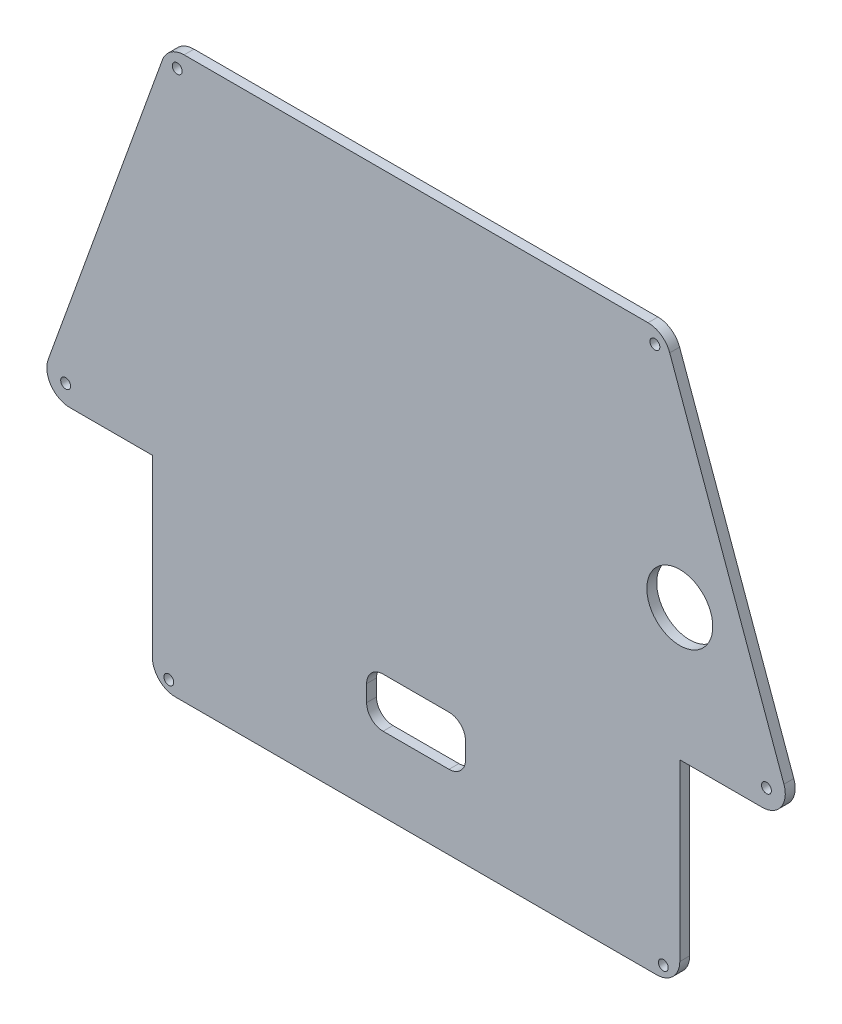
ISO-10303-21;
HEADER;
FILE_DESCRIPTION(('STEP AP214'),'2;1');
FILE_NAME('part.step','',(''),(''),'','','');
FILE_SCHEMA(('AUTOMOTIVE_DESIGN { 1 0 10303 214 1 1 1 1 }'));
ENDSEC;
DATA;
#1=APPLICATION_CONTEXT('core data for automotive mechanical design processes');
#2=APPLICATION_PROTOCOL_DEFINITION('international standard','automotive_design',2000,#1);
#3=PRODUCT_CONTEXT('',#1,'mechanical');
#4=PRODUCT('Part','Part','',(#3));
#5=PRODUCT_RELATED_PRODUCT_CATEGORY('part','',(#4));
#6=PRODUCT_DEFINITION_FORMATION('','',#4);
#7=PRODUCT_DEFINITION_CONTEXT('part definition',#1,'design');
#8=PRODUCT_DEFINITION('design','',#6,#7);
#9=PRODUCT_DEFINITION_SHAPE('','',#8);
#10=(LENGTH_UNIT() NAMED_UNIT(*) SI_UNIT(.MILLI.,.METRE.));
#11=(NAMED_UNIT(*) PLANE_ANGLE_UNIT() SI_UNIT($,.RADIAN.));
#12=(NAMED_UNIT(*) SI_UNIT($,.STERADIAN.) SOLID_ANGLE_UNIT());
#13=UNCERTAINTY_MEASURE_WITH_UNIT(LENGTH_MEASURE(1.E-05),#10,'distance_accuracy_value','');
#14=(GEOMETRIC_REPRESENTATION_CONTEXT(3) GLOBAL_UNCERTAINTY_ASSIGNED_CONTEXT((#13)) GLOBAL_UNIT_ASSIGNED_CONTEXT((#10,
#11,#12)) REPRESENTATION_CONTEXT('',''));
#15=CARTESIAN_POINT('',(0.,0.,0.));
#16=DIRECTION('',(0.,0.,1.));
#17=DIRECTION('',(1.,0.,0.));
#18=AXIS2_PLACEMENT_3D('',#15,#16,#17);
#19=CARTESIAN_POINT('',(105.000000000002,67.0000000000007,3.));
#20=DIRECTION('',(0.,0.,1.));
#21=DIRECTION('',(1.,0.,0.));
#22=AXIS2_PLACEMENT_3D('',#19,#20,#21);
#23=PLANE('',#22);
#24=CARTESIAN_POINT('',(-72.4413822321716,165.375717781692,3.));
#25=DIRECTION('',(0.,0.,1.));
#26=DIRECTION('',(1.,0.,0.));
#27=AXIS2_PLACEMENT_3D('',#24,#25,#26);
#28=CIRCLE('',#27,1.5);
#29=CARTESIAN_POINT('',(-70.9413822321716,165.375717781692,3.));
#30=VERTEX_POINT('',#29);
#31=EDGE_CURVE('E722',#30,#30,#28,.T.);
#32=ORIENTED_EDGE('',*,*,#31,.F.);
#33=EDGE_LOOP('',(#32));
#34=FACE_BOUND('',#33,.T.);
#35=CARTESIAN_POINT('',(106.291485680488,65.7561376704463,3.));
#36=DIRECTION('',(0.,0.,1.));
#37=DIRECTION('',(-1.,0.,0.));
#38=AXIS2_PLACEMENT_3D('',#35,#36,#37);
#39=CIRCLE('',#38,1.5);
#40=CARTESIAN_POINT('',(104.791485680488,65.7561376704463,3.));
#41=VERTEX_POINT('',#40);
#42=EDGE_CURVE('E222',#41,#41,#39,.T.);
#43=ORIENTED_EDGE('',*,*,#42,.F.);
#44=EDGE_LOOP('',(#43));
#45=FACE_BOUND('',#44,.T.);
#46=CARTESIAN_POINT('',(-74.9999999999981,3.55203370173264,3.));
#47=DIRECTION('',(0.,0.,1.));
#48=DIRECTION('',(1.,0.,0.));
#49=AXIS2_PLACEMENT_3D('',#46,#47,#48);
#50=CIRCLE('',#49,1.50000000000001);
#51=CARTESIAN_POINT('',(-73.4999999999981,3.55203370173264,3.));
#52=VERTEX_POINT('',#51);
#53=EDGE_CURVE('E258',#52,#52,#50,.T.);
#54=ORIENTED_EDGE('',*,*,#53,.F.);
#55=EDGE_LOOP('',(#54));
#56=FACE_BOUND('',#55,.T.);
#57=CARTESIAN_POINT('',(105.000000000002,67.0000000000007,3.));
#58=DIRECTION('',(0.,0.,1.));
#59=DIRECTION('',(1.,0.,0.));
#60=AXIS2_PLACEMENT_3D('',#57,#58,#59);
#61=CIRCLE('',#60,7.00000000000002);
#62=CARTESIAN_POINT('',(105.000000000002,60.0000000000007,3.));
#63=VERTEX_POINT('',#62);
#64=CARTESIAN_POINT('',(111.584524661794,69.3757177816926,3.));
#65=VERTEX_POINT('',#64);
#66=EDGE_CURVE('E270',#63,#65,#61,.T.);
#67=ORIENTED_EDGE('',*,*,#66,.T.);
#68=DIRECTION('',(-0.33938825452742,0.940646380256062,0.));
#69=VECTOR('',#68,1.);
#70=CARTESIAN_POINT('',(111.584524661794,69.3757177816926,3.));
#71=LINE('',#70,#69);
#72=CARTESIAN_POINT('',(76.9474143528568,165.375717781692,3.));
#73=VERTEX_POINT('',#72);
#74=EDGE_CURVE('E273',#65,#73,#71,.T.);
#75=ORIENTED_EDGE('',*,*,#74,.T.);
#76=CARTESIAN_POINT('',(70.3628896910644,163.,3.));
#77=DIRECTION('',(0.,0.,1.));
#78=DIRECTION('',(1.,0.,0.));
#79=AXIS2_PLACEMENT_3D('',#76,#77,#78);
#80=CIRCLE('',#79,7.00000000000001);
#81=CARTESIAN_POINT('',(70.3628896910644,170.,3.));
#82=VERTEX_POINT('',#81);
#83=EDGE_CURVE('E276',#73,#82,#80,.T.);
#84=ORIENTED_EDGE('',*,*,#83,.T.);
#85=DIRECTION('',(-1.,0.,0.));
#86=VECTOR('',#85,1.);
#87=CARTESIAN_POINT('',(-70.3628896910606,170.,3.));
#88=LINE('',#87,#86);
#89=CARTESIAN_POINT('',(-70.3628896910606,170.,3.));
#90=VERTEX_POINT('',#89);
#91=EDGE_CURVE('E278',#82,#90,#88,.T.);
#92=ORIENTED_EDGE('',*,*,#91,.T.);
#93=CARTESIAN_POINT('',(-70.3628896910606,163.,3.));
#94=DIRECTION('',(0.,0.,1.));
#95=DIRECTION('',(-1.,0.,0.));
#96=AXIS2_PLACEMENT_3D('',#93,#94,#95);
#97=CIRCLE('',#96,7.00000000000002);
#98=CARTESIAN_POINT('',(-76.947414352853,165.375717781692,3.));
#99=VERTEX_POINT('',#98);
#100=EDGE_CURVE('E280',#90,#99,#97,.T.);
#101=ORIENTED_EDGE('',*,*,#100,.T.);
#102=DIRECTION('',(-0.339388254527417,-0.940646380256063,0.));
#103=VECTOR('',#102,1.);
#104=CARTESIAN_POINT('',(-111.584524661791,69.3757177816919,3.));
#105=LINE('',#104,#103);
#106=CARTESIAN_POINT('',(-111.584524661791,69.3757177816919,3.));
#107=VERTEX_POINT('',#106);
#108=EDGE_CURVE('E282',#99,#107,#105,.T.);
#109=ORIENTED_EDGE('',*,*,#108,.T.);
#110=CARTESIAN_POINT('',(-104.999999999998,67.,3.));
#111=DIRECTION('',(0.,0.,1.));
#112=DIRECTION('',(-1.,0.,0.));
#113=AXIS2_PLACEMENT_3D('',#110,#111,#112);
#114=CIRCLE('',#113,7.);
#115=CARTESIAN_POINT('',(-104.999999999998,60.,3.));
#116=VERTEX_POINT('',#115);
#117=EDGE_CURVE('E284',#107,#116,#114,.T.);
#118=ORIENTED_EDGE('',*,*,#117,.T.);
#119=DIRECTION('',(1.,0.,0.));
#120=VECTOR('',#119,1.);
#121=CARTESIAN_POINT('',(-79.9999999999981,60.,3.));
#122=LINE('',#121,#120);
#123=CARTESIAN_POINT('',(-79.9999999999981,60.,3.));
#124=VERTEX_POINT('',#123);
#125=EDGE_CURVE('E286',#116,#124,#122,.T.);
#126=ORIENTED_EDGE('',*,*,#125,.T.);
#127=DIRECTION('',(0.,-1.,0.));
#128=VECTOR('',#127,1.);
#129=CARTESIAN_POINT('',(-79.9999999999981,7.,3.));
#130=LINE('',#129,#128);
#131=CARTESIAN_POINT('',(-79.9999999999981,7.,3.));
#132=VERTEX_POINT('',#131);
#133=EDGE_CURVE('E288',#124,#132,#130,.T.);
#134=ORIENTED_EDGE('',*,*,#133,.T.);
#135=CARTESIAN_POINT('',(-72.9999999999981,7.,3.));
#136=DIRECTION('',(0.,0.,1.));
#137=DIRECTION('',(1.,0.,0.));
#138=AXIS2_PLACEMENT_3D('',#135,#136,#137);
#139=CIRCLE('',#138,7.00000000000001);
#140=CARTESIAN_POINT('',(-72.9999999999981,0.,3.));
#141=VERTEX_POINT('',#140);
#142=EDGE_CURVE('E290',#132,#141,#139,.T.);
#143=ORIENTED_EDGE('',*,*,#142,.T.);
#144=DIRECTION('',(1.,0.,0.));
#145=VECTOR('',#144,1.);
#146=CARTESIAN_POINT('',(-72.9999999999981,0.,3.));
#147=LINE('',#146,#145);
#148=CARTESIAN_POINT('',(73.0000000000019,0.,3.));
#149=VERTEX_POINT('',#148);
#150=EDGE_CURVE('E292',#141,#149,#147,.T.);
#151=ORIENTED_EDGE('',*,*,#150,.T.);
#152=CARTESIAN_POINT('',(73.0000000000019,7.,3.));
#153=DIRECTION('',(0.,0.,1.));
#154=DIRECTION('',(1.,0.,0.));
#155=AXIS2_PLACEMENT_3D('',#152,#153,#154);
#156=CIRCLE('',#155,7.00000000000001);
#157=CARTESIAN_POINT('',(80.0000000000019,7.,3.));
#158=VERTEX_POINT('',#157);
#159=EDGE_CURVE('E294',#149,#158,#156,.T.);
#160=ORIENTED_EDGE('',*,*,#159,.T.);
#161=DIRECTION('',(0.,1.,0.));
#162=VECTOR('',#161,1.);
#163=CARTESIAN_POINT('',(80.0000000000019,7.,3.));
#164=LINE('',#163,#162);
#165=CARTESIAN_POINT('',(80.0000000000019,60.0000000000007,3.));
#166=VERTEX_POINT('',#165);
#167=EDGE_CURVE('E296',#158,#166,#164,.T.);
#168=ORIENTED_EDGE('',*,*,#167,.T.);
#169=DIRECTION('',(1.,0.,0.));
#170=VECTOR('',#169,1.);
#171=CARTESIAN_POINT('',(80.0000000000019,60.0000000000007,3.));
#172=LINE('',#171,#170);
#173=EDGE_CURVE('E298',#166,#63,#172,.T.);
#174=ORIENTED_EDGE('',*,*,#173,.T.);
#175=EDGE_LOOP('',(#67,#75,#84,#92,#101,#109,#118,#126,#134,#143,#151,#160,#168,#174));
#176=FACE_BOUND('',#175,.T.);
#177=CARTESIAN_POINT('',(80.0000000000019,100.000000000001,3.));
#178=DIRECTION('',(0.,0.,1.));
#179=DIRECTION('',(1.,0.,0.));
#180=AXIS2_PLACEMENT_3D('',#177,#178,#179);
#181=CIRCLE('',#180,9.99999999999999);
#182=CARTESIAN_POINT('',(90.0000000000019,100.000000000001,3.));
#183=VERTEX_POINT('',#182);
#184=EDGE_CURVE('E264',#183,#183,#181,.T.);
#185=ORIENTED_EDGE('',*,*,#184,.F.);
#186=EDGE_LOOP('',(#185));
#187=FACE_BOUND('',#186,.T.);
#188=CARTESIAN_POINT('',(-106.291485680485,65.7561376704463,3.));
#189=DIRECTION('',(0.,0.,1.));
#190=DIRECTION('',(1.,0.,0.));
#191=AXIS2_PLACEMENT_3D('',#188,#189,#190);
#192=CIRCLE('',#191,1.5);
#193=CARTESIAN_POINT('',(-104.791485680485,65.7561376704463,3.));
#194=VERTEX_POINT('',#193);
#195=EDGE_CURVE('E252',#194,#194,#192,.T.);
#196=ORIENTED_EDGE('',*,*,#195,.F.);
#197=EDGE_LOOP('',(#196));
#198=FACE_BOUND('',#197,.T.);
#199=DIRECTION('',(0.,1.,0.));
#200=VECTOR('',#199,1.);
#201=CARTESIAN_POINT('',(15.0000000000019,27.5,3.));
#202=LINE('',#201,#200);
#203=CARTESIAN_POINT('',(15.0000000000019,27.5,3.));
#204=VERTEX_POINT('',#203);
#205=CARTESIAN_POINT('',(15.0000000000019,32.5,3.));
#206=VERTEX_POINT('',#205);
#207=EDGE_CURVE('E192',#204,#206,#202,.T.);
#208=ORIENTED_EDGE('',*,*,#207,.F.);
#209=CARTESIAN_POINT('',(10.0000000000019,27.5,3.));
#210=DIRECTION('',(0.,0.,1.));
#211=DIRECTION('',(1.,0.,0.));
#212=AXIS2_PLACEMENT_3D('',#209,#210,#211);
#213=CIRCLE('',#212,5.);
#214=CARTESIAN_POINT('',(10.0000000000019,22.5,3.));
#215=VERTEX_POINT('',#214);
#216=EDGE_CURVE('E184',#215,#204,#213,.T.);
#217=ORIENTED_EDGE('',*,*,#216,.F.);
#218=DIRECTION('',(1.,0.,0.));
#219=VECTOR('',#218,1.);
#220=CARTESIAN_POINT('',(-9.9999999999981,22.5,3.));
#221=LINE('',#220,#219);
#222=CARTESIAN_POINT('',(-9.99999999999809,22.5,3.));
#223=VERTEX_POINT('',#222);
#224=EDGE_CURVE('E219',#223,#215,#221,.T.);
#225=ORIENTED_EDGE('',*,*,#224,.F.);
#226=CARTESIAN_POINT('',(-9.9999999999981,27.5,3.));
#227=DIRECTION('',(0.,0.,1.));
#228=DIRECTION('',(-1.,0.,0.));
#229=AXIS2_PLACEMENT_3D('',#226,#227,#228);
#230=CIRCLE('',#229,5.);
#231=CARTESIAN_POINT('',(-14.9999999999981,27.5,3.));
#232=VERTEX_POINT('',#231);
#233=EDGE_CURVE('E217',#232,#223,#230,.T.);
#234=ORIENTED_EDGE('',*,*,#233,.F.);
#235=DIRECTION('',(0.,-1.,0.));
#236=VECTOR('',#235,1.);
#237=CARTESIAN_POINT('',(-14.9999999999981,27.5,3.));
#238=LINE('',#237,#236);
#239=CARTESIAN_POINT('',(-14.9999999999981,32.5,3.));
#240=VERTEX_POINT('',#239);
#241=EDGE_CURVE('E215',#240,#232,#238,.T.);
#242=ORIENTED_EDGE('',*,*,#241,.F.);
#243=CARTESIAN_POINT('',(-9.9999999999981,32.5,3.));
#244=DIRECTION('',(0.,0.,1.));
#245=DIRECTION('',(-1.,0.,0.));
#246=AXIS2_PLACEMENT_3D('',#243,#244,#245);
#247=CIRCLE('',#246,5.);
#248=CARTESIAN_POINT('',(-9.9999999999981,37.5,3.));
#249=VERTEX_POINT('',#248);
#250=EDGE_CURVE('E213',#249,#240,#247,.T.);
#251=ORIENTED_EDGE('',*,*,#250,.F.);
#252=DIRECTION('',(-1.,0.,0.));
#253=VECTOR('',#252,1.);
#254=CARTESIAN_POINT('',(-9.9999999999981,37.5,3.));
#255=LINE('',#254,#253);
#256=CARTESIAN_POINT('',(10.0000000000019,37.5,3.));
#257=VERTEX_POINT('',#256);
#258=EDGE_CURVE('E208',#257,#249,#255,.T.);
#259=ORIENTED_EDGE('',*,*,#258,.F.);
#260=CARTESIAN_POINT('',(10.0000000000019,32.5,3.));
#261=DIRECTION('',(0.,0.,1.));
#262=DIRECTION('',(-1.,0.,0.));
#263=AXIS2_PLACEMENT_3D('',#260,#261,#262);
#264=CIRCLE('',#263,5.);
#265=EDGE_CURVE('E206',#206,#257,#264,.T.);
#266=ORIENTED_EDGE('',*,*,#265,.F.);
#267=EDGE_LOOP('',(#208,#217,#225,#234,#242,#251,#259,#266));
#268=FACE_BOUND('',#267,.T.);
#269=CARTESIAN_POINT('',(72.4413822321753,165.375717781692,3.));
#270=DIRECTION('',(0.,0.,1.));
#271=DIRECTION('',(-1.,0.,0.));
#272=AXIS2_PLACEMENT_3D('',#269,#270,#271);
#273=CIRCLE('',#272,1.5);
#274=CARTESIAN_POINT('',(70.9413822321753,165.375717781692,3.));
#275=VERTEX_POINT('',#274);
#276=EDGE_CURVE('E728',#275,#275,#273,.T.);
#277=ORIENTED_EDGE('',*,*,#276,.F.);
#278=EDGE_LOOP('',(#277));
#279=FACE_BOUND('',#278,.T.);
#280=CARTESIAN_POINT('',(75.0000000000019,3.55203370173264,3.));
#281=DIRECTION('',(0.,0.,1.));
#282=DIRECTION('',(-1.,0.,0.));
#283=AXIS2_PLACEMENT_3D('',#280,#281,#282);
#284=CIRCLE('',#283,1.50000000000001);
#285=CARTESIAN_POINT('',(73.5000000000019,3.55203370173264,3.));
#286=VERTEX_POINT('',#285);
#287=EDGE_CURVE('E713',#286,#286,#284,.T.);
#288=ORIENTED_EDGE('',*,*,#287,.F.);
#289=EDGE_LOOP('',(#288));
#290=FACE_BOUND('',#289,.T.);
#291=ADVANCED_FACE('F35',(#34,#45,#56,#176,#187,#198,#268,#279,#290),#23,.T.);
#292=CARTESIAN_POINT('',(105.000000000002,67.0000000000007,0.));
#293=DIRECTION('',(0.,0.,1.));
#294=DIRECTION('',(1.,0.,0.));
#295=AXIS2_PLACEMENT_3D('',#292,#293,#294);
#296=PLANE('',#295);
#297=CARTESIAN_POINT('',(-106.291485680485,65.7561376704463,0.));
#298=DIRECTION('',(0.,0.,1.));
#299=DIRECTION('',(1.,0.,0.));
#300=AXIS2_PLACEMENT_3D('',#297,#298,#299);
#301=CIRCLE('',#300,1.5);
#302=CARTESIAN_POINT('',(-104.791485680485,65.7561376704463,0.));
#303=VERTEX_POINT('',#302);
#304=EDGE_CURVE('E200',#303,#303,#301,.T.);
#305=ORIENTED_EDGE('',*,*,#304,.T.);
#306=EDGE_LOOP('',(#305));
#307=FACE_BOUND('',#306,.T.);
#308=CARTESIAN_POINT('',(-74.9999999999981,3.55203370173264,0.));
#309=DIRECTION('',(0.,0.,1.));
#310=DIRECTION('',(1.,0.,0.));
#311=AXIS2_PLACEMENT_3D('',#308,#309,#310);
#312=CIRCLE('',#311,1.50000000000001);
#313=CARTESIAN_POINT('',(-73.4999999999981,3.55203370173264,0.));
#314=VERTEX_POINT('',#313);
#315=EDGE_CURVE('E255',#314,#314,#312,.T.);
#316=ORIENTED_EDGE('',*,*,#315,.T.);
#317=EDGE_LOOP('',(#316));
#318=FACE_BOUND('',#317,.T.);
#319=CARTESIAN_POINT('',(80.0000000000019,100.000000000001,0.));
#320=DIRECTION('',(0.,0.,1.));
#321=DIRECTION('',(1.,0.,0.));
#322=AXIS2_PLACEMENT_3D('',#319,#320,#321);
#323=CIRCLE('',#322,9.99999999999999);
#324=CARTESIAN_POINT('',(90.0000000000019,100.000000000001,0.));
#325=VERTEX_POINT('',#324);
#326=EDGE_CURVE('E261',#325,#325,#323,.T.);
#327=ORIENTED_EDGE('',*,*,#326,.T.);
#328=EDGE_LOOP('',(#327));
#329=FACE_BOUND('',#328,.T.);
#330=CARTESIAN_POINT('',(105.000000000002,67.0000000000007,0.));
#331=DIRECTION('',(0.,0.,1.));
#332=DIRECTION('',(1.,0.,0.));
#333=AXIS2_PLACEMENT_3D('',#330,#331,#332);
#334=CIRCLE('',#333,7.00000000000002);
#335=CARTESIAN_POINT('',(105.000000000002,60.0000000000007,0.));
#336=VERTEX_POINT('',#335);
#337=CARTESIAN_POINT('',(111.584524661794,69.3757177816926,0.));
#338=VERTEX_POINT('',#337);
#339=EDGE_CURVE('E267',#336,#338,#334,.T.);
#340=ORIENTED_EDGE('',*,*,#339,.F.);
#341=DIRECTION('',(1.,0.,0.));
#342=VECTOR('',#341,1.);
#343=CARTESIAN_POINT('',(80.0000000000019,60.0000000000007,0.));
#344=LINE('',#343,#342);
#345=CARTESIAN_POINT('',(80.0000000000019,60.0000000000007,0.));
#346=VERTEX_POINT('',#345);
#347=EDGE_CURVE('E274',#346,#336,#344,.T.);
#348=ORIENTED_EDGE('',*,*,#347,.F.);
#349=DIRECTION('',(0.,1.,0.));
#350=VECTOR('',#349,1.);
#351=CARTESIAN_POINT('',(80.0000000000019,7.,0.));
#352=LINE('',#351,#350);
#353=CARTESIAN_POINT('',(80.0000000000019,7.,0.));
#354=VERTEX_POINT('',#353);
#355=EDGE_CURVE('E325',#354,#346,#352,.T.);
#356=ORIENTED_EDGE('',*,*,#355,.F.);
#357=CARTESIAN_POINT('',(73.0000000000019,7.,0.));
#358=DIRECTION('',(0.,0.,1.));
#359=DIRECTION('',(1.,0.,0.));
#360=AXIS2_PLACEMENT_3D('',#357,#358,#359);
#361=CIRCLE('',#360,7.00000000000001);
#362=CARTESIAN_POINT('',(73.0000000000019,0.,0.));
#363=VERTEX_POINT('',#362);
#364=EDGE_CURVE('E323',#363,#354,#361,.T.);
#365=ORIENTED_EDGE('',*,*,#364,.F.);
#366=DIRECTION('',(1.,0.,0.));
#367=VECTOR('',#366,1.);
#368=CARTESIAN_POINT('',(-72.9999999999981,0.,0.));
#369=LINE('',#368,#367);
#370=CARTESIAN_POINT('',(-72.9999999999981,0.,0.));
#371=VERTEX_POINT('',#370);
#372=EDGE_CURVE('E321',#371,#363,#369,.T.);
#373=ORIENTED_EDGE('',*,*,#372,.F.);
#374=CARTESIAN_POINT('',(-72.9999999999981,7.,0.));
#375=DIRECTION('',(0.,0.,1.));
#376=DIRECTION('',(1.,0.,0.));
#377=AXIS2_PLACEMENT_3D('',#374,#375,#376);
#378=CIRCLE('',#377,7.00000000000001);
#379=CARTESIAN_POINT('',(-79.9999999999981,7.,0.));
#380=VERTEX_POINT('',#379);
#381=EDGE_CURVE('E319',#380,#371,#378,.T.);
#382=ORIENTED_EDGE('',*,*,#381,.F.);
#383=DIRECTION('',(0.,-1.,0.));
#384=VECTOR('',#383,1.);
#385=CARTESIAN_POINT('',(-79.9999999999981,7.,0.));
#386=LINE('',#385,#384);
#387=CARTESIAN_POINT('',(-79.9999999999981,60.,0.));
#388=VERTEX_POINT('',#387);
#389=EDGE_CURVE('E317',#388,#380,#386,.T.);
#390=ORIENTED_EDGE('',*,*,#389,.F.);
#391=DIRECTION('',(1.,0.,0.));
#392=VECTOR('',#391,1.);
#393=CARTESIAN_POINT('',(-79.9999999999981,60.,0.));
#394=LINE('',#393,#392);
#395=CARTESIAN_POINT('',(-104.999999999998,60.,0.));
#396=VERTEX_POINT('',#395);
#397=EDGE_CURVE('E315',#396,#388,#394,.T.);
#398=ORIENTED_EDGE('',*,*,#397,.F.);
#399=CARTESIAN_POINT('',(-104.999999999998,67.,0.));
#400=DIRECTION('',(0.,0.,1.));
#401=DIRECTION('',(-1.,0.,0.));
#402=AXIS2_PLACEMENT_3D('',#399,#400,#401);
#403=CIRCLE('',#402,7.);
#404=CARTESIAN_POINT('',(-111.584524661791,69.3757177816919,0.));
#405=VERTEX_POINT('',#404);
#406=EDGE_CURVE('E313',#405,#396,#403,.T.);
#407=ORIENTED_EDGE('',*,*,#406,.F.);
#408=DIRECTION('',(-0.339388254527417,-0.940646380256063,0.));
#409=VECTOR('',#408,1.);
#410=CARTESIAN_POINT('',(-111.584524661791,69.3757177816919,0.));
#411=LINE('',#410,#409);
#412=CARTESIAN_POINT('',(-76.947414352853,165.375717781692,0.));
#413=VERTEX_POINT('',#412);
#414=EDGE_CURVE('E311',#413,#405,#411,.T.);
#415=ORIENTED_EDGE('',*,*,#414,.F.);
#416=CARTESIAN_POINT('',(-70.3628896910606,163.,0.));
#417=DIRECTION('',(0.,0.,1.));
#418=DIRECTION('',(-1.,0.,0.));
#419=AXIS2_PLACEMENT_3D('',#416,#417,#418);
#420=CIRCLE('',#419,7.00000000000002);
#421=CARTESIAN_POINT('',(-70.3628896910606,170.,0.));
#422=VERTEX_POINT('',#421);
#423=EDGE_CURVE('E309',#422,#413,#420,.T.);
#424=ORIENTED_EDGE('',*,*,#423,.F.);
#425=DIRECTION('',(-1.,0.,0.));
#426=VECTOR('',#425,1.);
#427=CARTESIAN_POINT('',(-70.3628896910606,170.,0.));
#428=LINE('',#427,#426);
#429=CARTESIAN_POINT('',(70.3628896910644,170.,0.));
#430=VERTEX_POINT('',#429);
#431=EDGE_CURVE('E307',#430,#422,#428,.T.);
#432=ORIENTED_EDGE('',*,*,#431,.F.);
#433=CARTESIAN_POINT('',(70.3628896910644,163.,0.));
#434=DIRECTION('',(0.,0.,1.));
#435=DIRECTION('',(1.,0.,0.));
#436=AXIS2_PLACEMENT_3D('',#433,#434,#435);
#437=CIRCLE('',#436,7.00000000000001);
#438=CARTESIAN_POINT('',(76.9474143528568,165.375717781692,0.));
#439=VERTEX_POINT('',#438);
#440=EDGE_CURVE('E305',#439,#430,#437,.T.);
#441=ORIENTED_EDGE('',*,*,#440,.F.);
#442=DIRECTION('',(-0.33938825452742,0.940646380256062,0.));
#443=VECTOR('',#442,1.);
#444=CARTESIAN_POINT('',(111.584524661794,69.3757177816926,0.));
#445=LINE('',#444,#443);
#446=EDGE_CURVE('E303',#338,#439,#445,.T.);
#447=ORIENTED_EDGE('',*,*,#446,.F.);
#448=EDGE_LOOP('',(#340,#348,#356,#365,#373,#382,#390,#398,#407,#415,#424,#432,#441,#447));
#449=FACE_BOUND('',#448,.T.);
#450=CARTESIAN_POINT('',(10.0000000000019,27.5,0.));
#451=DIRECTION('',(0.,0.,1.));
#452=DIRECTION('',(1.,0.,0.));
#453=AXIS2_PLACEMENT_3D('',#450,#451,#452);
#454=CIRCLE('',#453,5.);
#455=CARTESIAN_POINT('',(10.0000000000019,22.5,0.));
#456=VERTEX_POINT('',#455);
#457=CARTESIAN_POINT('',(15.0000000000019,27.5,0.));
#458=VERTEX_POINT('',#457);
#459=EDGE_CURVE('E58',#456,#458,#454,.T.);
#460=ORIENTED_EDGE('',*,*,#459,.T.);
#461=DIRECTION('',(0.,1.,0.));
#462=VECTOR('',#461,1.);
#463=CARTESIAN_POINT('',(15.0000000000019,27.5,0.));
#464=LINE('',#463,#462);
#465=CARTESIAN_POINT('',(15.0000000000019,32.5,0.));
#466=VERTEX_POINT('',#465);
#467=EDGE_CURVE('E199',#458,#466,#464,.T.);
#468=ORIENTED_EDGE('',*,*,#467,.T.);
#469=CARTESIAN_POINT('',(10.0000000000019,32.5,0.));
#470=DIRECTION('',(0.,0.,1.));
#471=DIRECTION('',(-1.,0.,0.));
#472=AXIS2_PLACEMENT_3D('',#469,#470,#471);
#473=CIRCLE('',#472,5.);
#474=CARTESIAN_POINT('',(10.0000000000019,37.5,0.));
#475=VERTEX_POINT('',#474);
#476=EDGE_CURVE('E224',#466,#475,#473,.T.);
#477=ORIENTED_EDGE('',*,*,#476,.T.);
#478=DIRECTION('',(-1.,0.,0.));
#479=VECTOR('',#478,1.);
#480=CARTESIAN_POINT('',(-9.9999999999981,37.5,0.));
#481=LINE('',#480,#479);
#482=CARTESIAN_POINT('',(-9.9999999999981,37.5,0.));
#483=VERTEX_POINT('',#482);
#484=EDGE_CURVE('E227',#475,#483,#481,.T.);
#485=ORIENTED_EDGE('',*,*,#484,.T.);
#486=CARTESIAN_POINT('',(-9.9999999999981,32.5,0.));
#487=DIRECTION('',(0.,0.,1.));
#488=DIRECTION('',(-1.,0.,0.));
#489=AXIS2_PLACEMENT_3D('',#486,#487,#488);
#490=CIRCLE('',#489,5.);
#491=CARTESIAN_POINT('',(-14.9999999999981,32.5,0.));
#492=VERTEX_POINT('',#491);
#493=EDGE_CURVE('E230',#483,#492,#490,.T.);
#494=ORIENTED_EDGE('',*,*,#493,.T.);
#495=DIRECTION('',(0.,-1.,0.));
#496=VECTOR('',#495,1.);
#497=CARTESIAN_POINT('',(-14.9999999999981,27.5,0.));
#498=LINE('',#497,#496);
#499=CARTESIAN_POINT('',(-14.9999999999981,27.5,0.));
#500=VERTEX_POINT('',#499);
#501=EDGE_CURVE('E233',#492,#500,#498,.T.);
#502=ORIENTED_EDGE('',*,*,#501,.T.);
#503=CARTESIAN_POINT('',(-9.9999999999981,27.5,0.));
#504=DIRECTION('',(0.,0.,1.));
#505=DIRECTION('',(-1.,0.,0.));
#506=AXIS2_PLACEMENT_3D('',#503,#504,#505);
#507=CIRCLE('',#506,5.);
#508=CARTESIAN_POINT('',(-9.9999999999981,22.5,0.));
#509=VERTEX_POINT('',#508);
#510=EDGE_CURVE('E236',#500,#509,#507,.T.);
#511=ORIENTED_EDGE('',*,*,#510,.T.);
#512=DIRECTION('',(1.,0.,0.));
#513=VECTOR('',#512,1.);
#514=CARTESIAN_POINT('',(-9.9999999999981,22.5,0.));
#515=LINE('',#514,#513);
#516=EDGE_CURVE('E193',#509,#456,#515,.T.);
#517=ORIENTED_EDGE('',*,*,#516,.T.);
#518=EDGE_LOOP('',(#460,#468,#477,#485,#494,#502,#511,#517));
#519=FACE_BOUND('',#518,.T.);
#520=CARTESIAN_POINT('',(106.291485680488,65.7561376704463,0.));
#521=DIRECTION('',(0.,0.,1.));
#522=DIRECTION('',(-1.,0.,0.));
#523=AXIS2_PLACEMENT_3D('',#520,#521,#522);
#524=CIRCLE('',#523,1.5);
#525=CARTESIAN_POINT('',(104.791485680488,65.7561376704463,0.));
#526=VERTEX_POINT('',#525);
#527=EDGE_CURVE('E731',#526,#526,#524,.T.);
#528=ORIENTED_EDGE('',*,*,#527,.T.);
#529=EDGE_LOOP('',(#528));
#530=FACE_BOUND('',#529,.T.);
#531=CARTESIAN_POINT('',(72.4413822321753,165.375717781692,0.));
#532=DIRECTION('',(0.,0.,1.));
#533=DIRECTION('',(-1.,0.,0.));
#534=AXIS2_PLACEMENT_3D('',#531,#532,#533);
#535=CIRCLE('',#534,1.5);
#536=CARTESIAN_POINT('',(70.9413822321753,165.375717781692,0.));
#537=VERTEX_POINT('',#536);
#538=EDGE_CURVE('E725',#537,#537,#535,.T.);
#539=ORIENTED_EDGE('',*,*,#538,.T.);
#540=EDGE_LOOP('',(#539));
#541=FACE_BOUND('',#540,.T.);
#542=CARTESIAN_POINT('',(-72.4413822321716,165.375717781692,0.));
#543=DIRECTION('',(0.,0.,1.));
#544=DIRECTION('',(1.,0.,0.));
#545=AXIS2_PLACEMENT_3D('',#542,#543,#544);
#546=CIRCLE('',#545,1.5);
#547=CARTESIAN_POINT('',(-70.9413822321716,165.375717781692,0.));
#548=VERTEX_POINT('',#547);
#549=EDGE_CURVE('E719',#548,#548,#546,.T.);
#550=ORIENTED_EDGE('',*,*,#549,.T.);
#551=EDGE_LOOP('',(#550));
#552=FACE_BOUND('',#551,.T.);
#553=CARTESIAN_POINT('',(75.0000000000019,3.55203370173264,0.));
#554=DIRECTION('',(0.,0.,1.));
#555=DIRECTION('',(-1.,0.,0.));
#556=AXIS2_PLACEMENT_3D('',#553,#554,#555);
#557=CIRCLE('',#556,1.50000000000001);
#558=CARTESIAN_POINT('',(73.5000000000019,3.55203370173264,0.));
#559=VERTEX_POINT('',#558);
#560=EDGE_CURVE('E716',#559,#559,#557,.T.);
#561=ORIENTED_EDGE('',*,*,#560,.T.);
#562=EDGE_LOOP('',(#561));
#563=FACE_BOUND('',#562,.T.);
#564=ADVANCED_FACE('F373',(#307,#318,#329,#449,#519,#530,#541,#552,#563),#296,.F.);
#565=CARTESIAN_POINT('',(105.000000000002,67.0000000000007,3.));
#566=DIRECTION('',(0.,0.,-1.));
#567=DIRECTION('',(-1.,0.,0.));
#568=AXIS2_PLACEMENT_3D('',#565,#566,#567);
#569=CYLINDRICAL_SURFACE('',#568,7.00000000000002);
#570=ORIENTED_EDGE('',*,*,#339,.T.);
#571=DIRECTION('',(0.,0.,-1.));
#572=VECTOR('',#571,1.);
#573=CARTESIAN_POINT('',(111.584524661794,69.3757177816926,3.));
#574=LINE('',#573,#572);
#575=EDGE_CURVE('E11',#65,#338,#574,.T.);
#576=ORIENTED_EDGE('',*,*,#575,.F.);
#577=ORIENTED_EDGE('',*,*,#66,.F.);
#578=DIRECTION('',(0.,0.,-1.));
#579=VECTOR('',#578,1.);
#580=CARTESIAN_POINT('',(105.000000000002,60.0000000000007,3.));
#581=LINE('',#580,#579);
#582=EDGE_CURVE('E300',#63,#336,#581,.T.);
#583=ORIENTED_EDGE('',*,*,#582,.T.);
#584=EDGE_LOOP('',(#570,#576,#577,#583));
#585=FACE_BOUND('',#584,.T.);
#586=ADVANCED_FACE('F37',(#585),#569,.T.);
#587=CARTESIAN_POINT('',(111.584524661794,69.3757177816926,3.));
#588=DIRECTION('',(-0.940646380256062,-0.33938825452742,0.));
#589=DIRECTION('',(0.33938825452742,-0.940646380256062,0.));
#590=AXIS2_PLACEMENT_3D('',#587,#588,#589);
#591=PLANE('',#590);
#592=ORIENTED_EDGE('',*,*,#446,.T.);
#593=DIRECTION('',(0.,0.,-1.));
#594=VECTOR('',#593,1.);
#595=CARTESIAN_POINT('',(76.9474143528568,165.375717781692,3.));
#596=LINE('',#595,#594);
#597=EDGE_CURVE('E43',#73,#439,#596,.T.);
#598=ORIENTED_EDGE('',*,*,#597,.F.);
#599=ORIENTED_EDGE('',*,*,#74,.F.);
#600=ORIENTED_EDGE('',*,*,#575,.T.);
#601=EDGE_LOOP('',(#592,#598,#599,#600));
#602=FACE_BOUND('',#601,.T.);
#603=ADVANCED_FACE('F391',(#602),#591,.F.);
#604=CARTESIAN_POINT('',(70.3628896910644,163.,3.));
#605=DIRECTION('',(0.,0.,-1.));
#606=DIRECTION('',(-1.,0.,0.));
#607=AXIS2_PLACEMENT_3D('',#604,#605,#606);
#608=CYLINDRICAL_SURFACE('',#607,7.00000000000001);
#609=ORIENTED_EDGE('',*,*,#440,.T.);
#610=DIRECTION('',(0.,0.,-1.));
#611=VECTOR('',#610,1.);
#612=CARTESIAN_POINT('',(70.3628896910644,170.,3.));
#613=LINE('',#612,#611);
#614=EDGE_CURVE('E360',#82,#430,#613,.T.);
#615=ORIENTED_EDGE('',*,*,#614,.F.);
#616=ORIENTED_EDGE('',*,*,#83,.F.);
#617=ORIENTED_EDGE('',*,*,#597,.T.);
#618=EDGE_LOOP('',(#609,#615,#616,#617));
#619=FACE_BOUND('',#618,.T.);
#620=ADVANCED_FACE('F367',(#619),#608,.T.);
#621=CARTESIAN_POINT('',(-70.3628896910606,170.,3.));
#622=DIRECTION('',(0.,-1.,0.));
#623=DIRECTION('',(0.,0.,-1.));
#624=AXIS2_PLACEMENT_3D('',#621,#622,#623);
#625=PLANE('',#624);
#626=ORIENTED_EDGE('',*,*,#431,.T.);
#627=DIRECTION('',(0.,0.,-1.));
#628=VECTOR('',#627,1.);
#629=CARTESIAN_POINT('',(-70.3628896910606,170.,3.));
#630=LINE('',#629,#628);
#631=EDGE_CURVE('E357',#90,#422,#630,.T.);
#632=ORIENTED_EDGE('',*,*,#631,.F.);
#633=ORIENTED_EDGE('',*,*,#91,.F.);
#634=ORIENTED_EDGE('',*,*,#614,.T.);
#635=EDGE_LOOP('',(#626,#632,#633,#634));
#636=FACE_BOUND('',#635,.T.);
#637=ADVANCED_FACE('F379',(#636),#625,.F.);
#638=CARTESIAN_POINT('',(-70.3628896910606,163.,3.));
#639=DIRECTION('',(0.,0.,-1.));
#640=DIRECTION('',(-1.,0.,0.));
#641=AXIS2_PLACEMENT_3D('',#638,#639,#640);
#642=CYLINDRICAL_SURFACE('',#641,7.00000000000002);
#643=ORIENTED_EDGE('',*,*,#423,.T.);
#644=DIRECTION('',(0.,0.,-1.));
#645=VECTOR('',#644,1.);
#646=CARTESIAN_POINT('',(-76.947414352853,165.375717781692,3.));
#647=LINE('',#646,#645);
#648=EDGE_CURVE('E354',#99,#413,#647,.T.);
#649=ORIENTED_EDGE('',*,*,#648,.F.);
#650=ORIENTED_EDGE('',*,*,#100,.F.);
#651=ORIENTED_EDGE('',*,*,#631,.T.);
#652=EDGE_LOOP('',(#643,#649,#650,#651));
#653=FACE_BOUND('',#652,.T.);
#654=ADVANCED_FACE('F383',(#653),#642,.T.);
#655=CARTESIAN_POINT('',(-111.584524661791,69.3757177816919,3.));
#656=DIRECTION('',(0.940646380256063,-0.339388254527417,0.));
#657=DIRECTION('',(0.339388254527417,0.940646380256063,0.));
#658=AXIS2_PLACEMENT_3D('',#655,#656,#657);
#659=PLANE('',#658);
#660=ORIENTED_EDGE('',*,*,#414,.T.);
#661=DIRECTION('',(0.,0.,-1.));
#662=VECTOR('',#661,1.);
#663=CARTESIAN_POINT('',(-111.584524661791,69.3757177816919,3.));
#664=LINE('',#663,#662);
#665=EDGE_CURVE('E351',#107,#405,#664,.T.);
#666=ORIENTED_EDGE('',*,*,#665,.F.);
#667=ORIENTED_EDGE('',*,*,#108,.F.);
#668=ORIENTED_EDGE('',*,*,#648,.T.);
#669=EDGE_LOOP('',(#660,#666,#667,#668));
#670=FACE_BOUND('',#669,.T.);
#671=ADVANCED_FACE('F434',(#670),#659,.F.);
#672=CARTESIAN_POINT('',(-104.999999999998,67.,3.));
#673=DIRECTION('',(0.,0.,-1.));
#674=DIRECTION('',(-1.,0.,0.));
#675=AXIS2_PLACEMENT_3D('',#672,#673,#674);
#676=CYLINDRICAL_SURFACE('',#675,7.);
#677=ORIENTED_EDGE('',*,*,#406,.T.);
#678=DIRECTION('',(0.,0.,-1.));
#679=VECTOR('',#678,1.);
#680=CARTESIAN_POINT('',(-104.999999999998,60.,3.));
#681=LINE('',#680,#679);
#682=EDGE_CURVE('E348',#116,#396,#681,.T.);
#683=ORIENTED_EDGE('',*,*,#682,.F.);
#684=ORIENTED_EDGE('',*,*,#117,.F.);
#685=ORIENTED_EDGE('',*,*,#665,.T.);
#686=EDGE_LOOP('',(#677,#683,#684,#685));
#687=FACE_BOUND('',#686,.T.);
#688=ADVANCED_FACE('F432',(#687),#676,.T.);
#689=CARTESIAN_POINT('',(-79.9999999999981,60.,3.));
#690=DIRECTION('',(0.,1.,0.));
#691=DIRECTION('',(0.,0.,1.));
#692=AXIS2_PLACEMENT_3D('',#689,#690,#691);
#693=PLANE('',#692);
#694=ORIENTED_EDGE('',*,*,#397,.T.);
#695=DIRECTION('',(0.,0.,-1.));
#696=VECTOR('',#695,1.);
#697=CARTESIAN_POINT('',(-79.9999999999981,60.,3.));
#698=LINE('',#697,#696);
#699=EDGE_CURVE('E345',#124,#388,#698,.T.);
#700=ORIENTED_EDGE('',*,*,#699,.F.);
#701=ORIENTED_EDGE('',*,*,#125,.F.);
#702=ORIENTED_EDGE('',*,*,#682,.T.);
#703=EDGE_LOOP('',(#694,#700,#701,#702));
#704=FACE_BOUND('',#703,.T.);
#705=ADVANCED_FACE('F427',(#704),#693,.F.);
#706=CARTESIAN_POINT('',(-79.9999999999981,7.,3.));
#707=DIRECTION('',(1.,0.,0.));
#708=DIRECTION('',(0.,1.,0.));
#709=AXIS2_PLACEMENT_3D('',#706,#707,#708);
#710=PLANE('',#709);
#711=ORIENTED_EDGE('',*,*,#389,.T.);
#712=DIRECTION('',(0.,0.,-1.));
#713=VECTOR('',#712,1.);
#714=CARTESIAN_POINT('',(-79.9999999999981,7.,3.));
#715=LINE('',#714,#713);
#716=EDGE_CURVE('E342',#132,#380,#715,.T.);
#717=ORIENTED_EDGE('',*,*,#716,.F.);
#718=ORIENTED_EDGE('',*,*,#133,.F.);
#719=ORIENTED_EDGE('',*,*,#699,.T.);
#720=EDGE_LOOP('',(#711,#717,#718,#719));
#721=FACE_BOUND('',#720,.T.);
#722=ADVANCED_FACE('F422',(#721),#710,.F.);
#723=CARTESIAN_POINT('',(-72.9999999999981,7.,3.));
#724=DIRECTION('',(0.,0.,-1.));
#725=DIRECTION('',(-1.,0.,0.));
#726=AXIS2_PLACEMENT_3D('',#723,#724,#725);
#727=CYLINDRICAL_SURFACE('',#726,7.00000000000001);
#728=ORIENTED_EDGE('',*,*,#381,.T.);
#729=DIRECTION('',(0.,0.,-1.));
#730=VECTOR('',#729,1.);
#731=CARTESIAN_POINT('',(-72.9999999999981,0.,3.));
#732=LINE('',#731,#730);
#733=EDGE_CURVE('E339',#141,#371,#732,.T.);
#734=ORIENTED_EDGE('',*,*,#733,.F.);
#735=ORIENTED_EDGE('',*,*,#142,.F.);
#736=ORIENTED_EDGE('',*,*,#716,.T.);
#737=EDGE_LOOP('',(#728,#734,#735,#736));
#738=FACE_BOUND('',#737,.T.);
#739=ADVANCED_FACE('F418',(#738),#727,.T.);
#740=CARTESIAN_POINT('',(-72.9999999999981,0.,3.));
#741=DIRECTION('',(0.,1.,0.));
#742=DIRECTION('',(0.,0.,1.));
#743=AXIS2_PLACEMENT_3D('',#740,#741,#742);
#744=PLANE('',#743);
#745=ORIENTED_EDGE('',*,*,#372,.T.);
#746=DIRECTION('',(0.,0.,-1.));
#747=VECTOR('',#746,1.);
#748=CARTESIAN_POINT('',(73.0000000000019,0.,3.));
#749=LINE('',#748,#747);
#750=EDGE_CURVE('E336',#149,#363,#749,.T.);
#751=ORIENTED_EDGE('',*,*,#750,.F.);
#752=ORIENTED_EDGE('',*,*,#150,.F.);
#753=ORIENTED_EDGE('',*,*,#733,.T.);
#754=EDGE_LOOP('',(#745,#751,#752,#753));
#755=FACE_BOUND('',#754,.T.);
#756=ADVANCED_FACE('F413',(#755),#744,.F.);
#757=CARTESIAN_POINT('',(73.0000000000019,7.,3.));
#758=DIRECTION('',(0.,0.,-1.));
#759=DIRECTION('',(-1.,0.,0.));
#760=AXIS2_PLACEMENT_3D('',#757,#758,#759);
#761=CYLINDRICAL_SURFACE('',#760,7.00000000000001);
#762=ORIENTED_EDGE('',*,*,#364,.T.);
#763=DIRECTION('',(0.,0.,-1.));
#764=VECTOR('',#763,1.);
#765=CARTESIAN_POINT('',(80.0000000000019,7.,3.));
#766=LINE('',#765,#764);
#767=EDGE_CURVE('E333',#158,#354,#766,.T.);
#768=ORIENTED_EDGE('',*,*,#767,.F.);
#769=ORIENTED_EDGE('',*,*,#159,.F.);
#770=ORIENTED_EDGE('',*,*,#750,.T.);
#771=EDGE_LOOP('',(#762,#768,#769,#770));
#772=FACE_BOUND('',#771,.T.);
#773=ADVANCED_FACE('F407',(#772),#761,.T.);
#774=CARTESIAN_POINT('',(80.0000000000019,7.,3.));
#775=DIRECTION('',(-1.,0.,0.));
#776=DIRECTION('',(0.,-1.,0.));
#777=AXIS2_PLACEMENT_3D('',#774,#775,#776);
#778=PLANE('',#777);
#779=ORIENTED_EDGE('',*,*,#355,.T.);
#780=DIRECTION('',(0.,0.,-1.));
#781=VECTOR('',#780,1.);
#782=CARTESIAN_POINT('',(80.0000000000019,60.0000000000007,3.));
#783=LINE('',#782,#781);
#784=EDGE_CURVE('E330',#166,#346,#783,.T.);
#785=ORIENTED_EDGE('',*,*,#784,.F.);
#786=ORIENTED_EDGE('',*,*,#167,.F.);
#787=ORIENTED_EDGE('',*,*,#767,.T.);
#788=EDGE_LOOP('',(#779,#785,#786,#787));
#789=FACE_BOUND('',#788,.T.);
#790=ADVANCED_FACE('F403',(#789),#778,.F.);
#791=CARTESIAN_POINT('',(80.0000000000019,60.0000000000007,3.));
#792=DIRECTION('',(0.,1.,0.));
#793=DIRECTION('',(-1.,0.,0.));
#794=AXIS2_PLACEMENT_3D('',#791,#792,#793);
#795=PLANE('',#794);
#796=ORIENTED_EDGE('',*,*,#347,.T.);
#797=ORIENTED_EDGE('',*,*,#582,.F.);
#798=ORIENTED_EDGE('',*,*,#173,.F.);
#799=ORIENTED_EDGE('',*,*,#784,.T.);
#800=EDGE_LOOP('',(#796,#797,#798,#799));
#801=FACE_BOUND('',#800,.T.);
#802=ADVANCED_FACE('F398',(#801),#795,.F.);
#803=CARTESIAN_POINT('',(80.0000000000019,100.000000000001,3.));
#804=DIRECTION('',(0.,0.,-1.));
#805=DIRECTION('',(-1.,0.,0.));
#806=AXIS2_PLACEMENT_3D('',#803,#804,#805);
#807=CYLINDRICAL_SURFACE('',#806,9.99999999999999);
#808=ORIENTED_EDGE('',*,*,#184,.T.);
#809=EDGE_LOOP('',(#808));
#810=FACE_BOUND('',#809,.T.);
#811=ORIENTED_EDGE('',*,*,#326,.F.);
#812=EDGE_LOOP('',(#811));
#813=FACE_BOUND('',#812,.T.);
#814=ADVANCED_FACE('F454',(#810,#813),#807,.F.);
#815=CARTESIAN_POINT('',(-74.9999999999981,3.55203370173264,3.));
#816=DIRECTION('',(0.,0.,-1.));
#817=DIRECTION('',(-1.,0.,0.));
#818=AXIS2_PLACEMENT_3D('',#815,#816,#817);
#819=CYLINDRICAL_SURFACE('',#818,1.50000000000001);
#820=ORIENTED_EDGE('',*,*,#53,.T.);
#821=EDGE_LOOP('',(#820));
#822=FACE_BOUND('',#821,.T.);
#823=ORIENTED_EDGE('',*,*,#315,.F.);
#824=EDGE_LOOP('',(#823));
#825=FACE_BOUND('',#824,.T.);
#826=ADVANCED_FACE('F504',(#822,#825),#819,.F.);
#827=CARTESIAN_POINT('',(-106.291485680485,65.7561376704463,3.));
#828=DIRECTION('',(0.,0.,-1.));
#829=DIRECTION('',(-1.,0.,0.));
#830=AXIS2_PLACEMENT_3D('',#827,#828,#829);
#831=CYLINDRICAL_SURFACE('',#830,1.5);
#832=ORIENTED_EDGE('',*,*,#195,.T.);
#833=EDGE_LOOP('',(#832));
#834=FACE_BOUND('',#833,.T.);
#835=ORIENTED_EDGE('',*,*,#304,.F.);
#836=EDGE_LOOP('',(#835));
#837=FACE_BOUND('',#836,.T.);
#838=ADVANCED_FACE('F511',(#834,#837),#831,.F.);
#839=CARTESIAN_POINT('',(10.0000000000019,27.5,3.));
#840=DIRECTION('',(0.,0.,-1.));
#841=DIRECTION('',(-1.,0.,0.));
#842=AXIS2_PLACEMENT_3D('',#839,#840,#841);
#843=CYLINDRICAL_SURFACE('',#842,5.);
#844=ORIENTED_EDGE('',*,*,#459,.F.);
#845=DIRECTION('',(0.,0.,-1.));
#846=VECTOR('',#845,1.);
#847=CARTESIAN_POINT('',(10.0000000000019,22.5,3.));
#848=LINE('',#847,#846);
#849=EDGE_CURVE('E188',#215,#456,#848,.T.);
#850=ORIENTED_EDGE('',*,*,#849,.F.);
#851=ORIENTED_EDGE('',*,*,#216,.T.);
#852=DIRECTION('',(0.,0.,-1.));
#853=VECTOR('',#852,1.);
#854=CARTESIAN_POINT('',(15.0000000000019,27.5,3.));
#855=LINE('',#854,#853);
#856=EDGE_CURVE('E187',#204,#458,#855,.T.);
#857=ORIENTED_EDGE('',*,*,#856,.T.);
#858=EDGE_LOOP('',(#844,#850,#851,#857));
#859=FACE_BOUND('',#858,.T.);
#860=ADVANCED_FACE('F186',(#859),#843,.F.);
#861=CARTESIAN_POINT('',(15.0000000000019,27.5,3.));
#862=DIRECTION('',(-1.,0.,0.));
#863=DIRECTION('',(0.,-1.,0.));
#864=AXIS2_PLACEMENT_3D('',#861,#862,#863);
#865=PLANE('',#864);
#866=ORIENTED_EDGE('',*,*,#467,.F.);
#867=ORIENTED_EDGE('',*,*,#856,.F.);
#868=ORIENTED_EDGE('',*,*,#207,.T.);
#869=DIRECTION('',(0.,0.,-1.));
#870=VECTOR('',#869,1.);
#871=CARTESIAN_POINT('',(15.0000000000019,32.5,3.));
#872=LINE('',#871,#870);
#873=EDGE_CURVE('E201',#206,#466,#872,.T.);
#874=ORIENTED_EDGE('',*,*,#873,.T.);
#875=EDGE_LOOP('',(#866,#867,#868,#874));
#876=FACE_BOUND('',#875,.T.);
#877=ADVANCED_FACE('F196',(#876),#865,.T.);
#878=CARTESIAN_POINT('',(10.0000000000019,32.5,3.));
#879=DIRECTION('',(0.,0.,-1.));
#880=DIRECTION('',(-1.,0.,0.));
#881=AXIS2_PLACEMENT_3D('',#878,#879,#880);
#882=CYLINDRICAL_SURFACE('',#881,5.);
#883=ORIENTED_EDGE('',*,*,#476,.F.);
#884=ORIENTED_EDGE('',*,*,#873,.F.);
#885=ORIENTED_EDGE('',*,*,#265,.T.);
#886=DIRECTION('',(0.,0.,-1.));
#887=VECTOR('',#886,1.);
#888=CARTESIAN_POINT('',(10.0000000000019,37.5,3.));
#889=LINE('',#888,#887);
#890=EDGE_CURVE('E249',#257,#475,#889,.T.);
#891=ORIENTED_EDGE('',*,*,#890,.T.);
#892=EDGE_LOOP('',(#883,#884,#885,#891));
#893=FACE_BOUND('',#892,.T.);
#894=ADVANCED_FACE('F531',(#893),#882,.F.);
#895=CARTESIAN_POINT('',(-9.9999999999981,37.5,3.));
#896=DIRECTION('',(0.,-1.,0.));
#897=DIRECTION('',(0.,0.,-1.));
#898=AXIS2_PLACEMENT_3D('',#895,#896,#897);
#899=PLANE('',#898);
#900=ORIENTED_EDGE('',*,*,#484,.F.);
#901=ORIENTED_EDGE('',*,*,#890,.F.);
#902=ORIENTED_EDGE('',*,*,#258,.T.);
#903=DIRECTION('',(0.,0.,-1.));
#904=VECTOR('',#903,1.);
#905=CARTESIAN_POINT('',(-9.9999999999981,37.5,3.));
#906=LINE('',#905,#904);
#907=EDGE_CURVE('E247',#249,#483,#906,.T.);
#908=ORIENTED_EDGE('',*,*,#907,.T.);
#909=EDGE_LOOP('',(#900,#901,#902,#908));
#910=FACE_BOUND('',#909,.T.);
#911=ADVANCED_FACE('F538',(#910),#899,.T.);
#912=CARTESIAN_POINT('',(-9.9999999999981,32.5,3.));
#913=DIRECTION('',(0.,0.,-1.));
#914=DIRECTION('',(-1.,0.,0.));
#915=AXIS2_PLACEMENT_3D('',#912,#913,#914);
#916=CYLINDRICAL_SURFACE('',#915,5.);
#917=ORIENTED_EDGE('',*,*,#493,.F.);
#918=ORIENTED_EDGE('',*,*,#907,.F.);
#919=ORIENTED_EDGE('',*,*,#250,.T.);
#920=DIRECTION('',(0.,0.,-1.));
#921=VECTOR('',#920,1.);
#922=CARTESIAN_POINT('',(-14.9999999999981,32.5,3.));
#923=LINE('',#922,#921);
#924=EDGE_CURVE('E245',#240,#492,#923,.T.);
#925=ORIENTED_EDGE('',*,*,#924,.T.);
#926=EDGE_LOOP('',(#917,#918,#919,#925));
#927=FACE_BOUND('',#926,.T.);
#928=ADVANCED_FACE('F546',(#927),#916,.F.);
#929=CARTESIAN_POINT('',(-14.9999999999981,27.5,3.));
#930=DIRECTION('',(1.,0.,0.));
#931=DIRECTION('',(0.,1.,0.));
#932=AXIS2_PLACEMENT_3D('',#929,#930,#931);
#933=PLANE('',#932);
#934=ORIENTED_EDGE('',*,*,#501,.F.);
#935=ORIENTED_EDGE('',*,*,#924,.F.);
#936=ORIENTED_EDGE('',*,*,#241,.T.);
#937=DIRECTION('',(0.,0.,-1.));
#938=VECTOR('',#937,1.);
#939=CARTESIAN_POINT('',(-14.9999999999981,27.5,3.));
#940=LINE('',#939,#938);
#941=EDGE_CURVE('E243',#232,#500,#940,.T.);
#942=ORIENTED_EDGE('',*,*,#941,.T.);
#943=EDGE_LOOP('',(#934,#935,#936,#942));
#944=FACE_BOUND('',#943,.T.);
#945=ADVANCED_FACE('F554',(#944),#933,.T.);
#946=CARTESIAN_POINT('',(-9.9999999999981,27.5,3.));
#947=DIRECTION('',(0.,0.,-1.));
#948=DIRECTION('',(-1.,0.,0.));
#949=AXIS2_PLACEMENT_3D('',#946,#947,#948);
#950=CYLINDRICAL_SURFACE('',#949,5.);
#951=ORIENTED_EDGE('',*,*,#510,.F.);
#952=ORIENTED_EDGE('',*,*,#941,.F.);
#953=ORIENTED_EDGE('',*,*,#233,.T.);
#954=DIRECTION('',(0.,0.,-1.));
#955=VECTOR('',#954,1.);
#956=CARTESIAN_POINT('',(-9.9999999999981,22.5,3.));
#957=LINE('',#956,#955);
#958=EDGE_CURVE('E50',#223,#509,#957,.T.);
#959=ORIENTED_EDGE('',*,*,#958,.T.);
#960=EDGE_LOOP('',(#951,#952,#953,#959));
#961=FACE_BOUND('',#960,.T.);
#962=ADVANCED_FACE('F562',(#961),#950,.F.);
#963=CARTESIAN_POINT('',(-9.9999999999981,22.5,3.));
#964=DIRECTION('',(0.,1.,0.));
#965=DIRECTION('',(0.,0.,1.));
#966=AXIS2_PLACEMENT_3D('',#963,#964,#965);
#967=PLANE('',#966);
#968=ORIENTED_EDGE('',*,*,#516,.F.);
#969=ORIENTED_EDGE('',*,*,#958,.F.);
#970=ORIENTED_EDGE('',*,*,#224,.T.);
#971=ORIENTED_EDGE('',*,*,#849,.T.);
#972=EDGE_LOOP('',(#968,#969,#970,#971));
#973=FACE_BOUND('',#972,.T.);
#974=ADVANCED_FACE('F570',(#973),#967,.T.);
#975=CARTESIAN_POINT('',(106.291485680488,65.7561376704463,3.));
#976=DIRECTION('',(0.,0.,-1.));
#977=DIRECTION('',(-1.,0.,0.));
#978=AXIS2_PLACEMENT_3D('',#975,#976,#977);
#979=CYLINDRICAL_SURFACE('',#978,1.5);
#980=ORIENTED_EDGE('',*,*,#42,.T.);
#981=EDGE_LOOP('',(#980));
#982=FACE_BOUND('',#981,.T.);
#983=ORIENTED_EDGE('',*,*,#527,.F.);
#984=EDGE_LOOP('',(#983));
#985=FACE_BOUND('',#984,.T.);
#986=ADVANCED_FACE('F578',(#982,#985),#979,.F.);
#987=CARTESIAN_POINT('',(72.4413822321753,165.375717781692,3.));
#988=DIRECTION('',(0.,0.,-1.));
#989=DIRECTION('',(-1.,0.,0.));
#990=AXIS2_PLACEMENT_3D('',#987,#988,#989);
#991=CYLINDRICAL_SURFACE('',#990,1.5);
#992=ORIENTED_EDGE('',*,*,#276,.T.);
#993=EDGE_LOOP('',(#992));
#994=FACE_BOUND('',#993,.T.);
#995=ORIENTED_EDGE('',*,*,#538,.F.);
#996=EDGE_LOOP('',(#995));
#997=FACE_BOUND('',#996,.T.);
#998=ADVANCED_FACE('F585',(#994,#997),#991,.F.);
#999=CARTESIAN_POINT('',(-72.4413822321716,165.375717781692,3.));
#1000=DIRECTION('',(0.,0.,-1.));
#1001=DIRECTION('',(-1.,0.,0.));
#1002=AXIS2_PLACEMENT_3D('',#999,#1000,#1001);
#1003=CYLINDRICAL_SURFACE('',#1002,1.5);
#1004=ORIENTED_EDGE('',*,*,#31,.T.);
#1005=EDGE_LOOP('',(#1004));
#1006=FACE_BOUND('',#1005,.T.);
#1007=ORIENTED_EDGE('',*,*,#549,.F.);
#1008=EDGE_LOOP('',(#1007));
#1009=FACE_BOUND('',#1008,.T.);
#1010=ADVANCED_FACE('F593',(#1006,#1009),#1003,.F.);
#1011=CARTESIAN_POINT('',(75.0000000000019,3.55203370173264,3.));
#1012=DIRECTION('',(0.,0.,-1.));
#1013=DIRECTION('',(-1.,0.,0.));
#1014=AXIS2_PLACEMENT_3D('',#1011,#1012,#1013);
#1015=CYLINDRICAL_SURFACE('',#1014,1.50000000000001);
#1016=ORIENTED_EDGE('',*,*,#287,.T.);
#1017=EDGE_LOOP('',(#1016));
#1018=FACE_BOUND('',#1017,.T.);
#1019=ORIENTED_EDGE('',*,*,#560,.F.);
#1020=EDGE_LOOP('',(#1019));
#1021=FACE_BOUND('',#1020,.T.);
#1022=ADVANCED_FACE('F601',(#1018,#1021),#1015,.F.);
#1023=CLOSED_SHELL('',(#291,#564,#586,#603,#620,#637,#654,#671,#688,#705,#722,#739,#756,#773,
#790,#802,#814,#826,#838,#860,#877,#894,#911,#928,#945,#962,#974,#986,#998,#1010,#1022));
#1024=MANIFOLD_SOLID_BREP('B2',#1023);
#1025=ADVANCED_BREP_SHAPE_REPRESENTATION('',(#18,#1024),#14);
#1026=SHAPE_DEFINITION_REPRESENTATION(#9,#1025);
ENDSEC;
END-ISO-10303-21;
